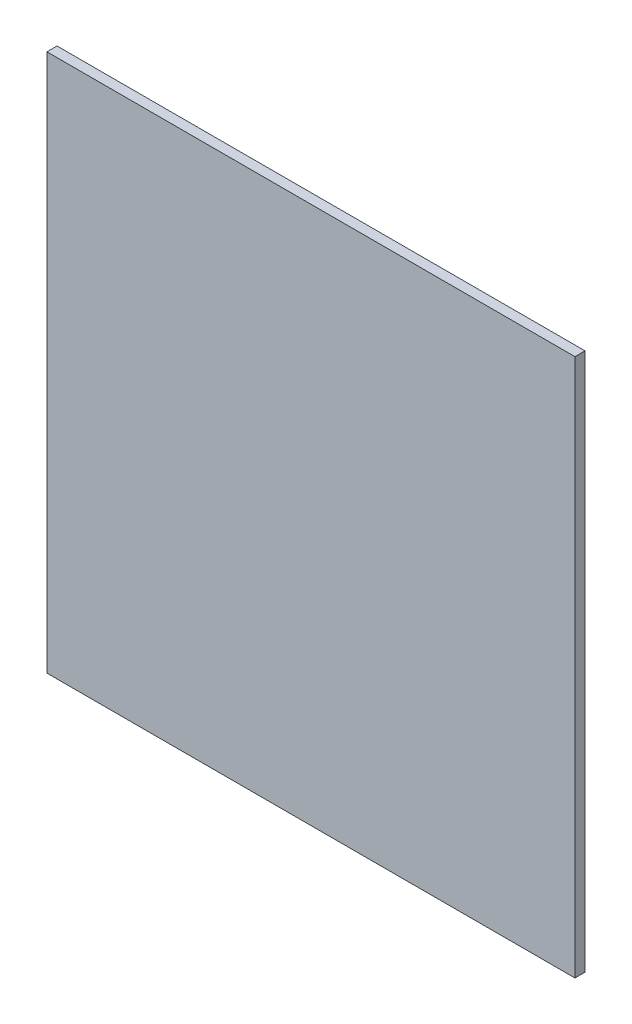
ISO-10303-21;
HEADER;
FILE_DESCRIPTION(('STEP AP214'),'2;1');
FILE_NAME('part.step','',(''),(''),'','','');
FILE_SCHEMA(('AUTOMOTIVE_DESIGN { 1 0 10303 214 1 1 1 1 }'));
ENDSEC;
DATA;
#1=APPLICATION_CONTEXT('core data for automotive mechanical design processes');
#2=APPLICATION_PROTOCOL_DEFINITION('international standard','automotive_design',2000,#1);
#3=PRODUCT_CONTEXT('',#1,'mechanical');
#4=PRODUCT('Part','Part','',(#3));
#5=PRODUCT_RELATED_PRODUCT_CATEGORY('part','',(#4));
#6=PRODUCT_DEFINITION_FORMATION('','',#4);
#7=PRODUCT_DEFINITION_CONTEXT('part definition',#1,'design');
#8=PRODUCT_DEFINITION('design','',#6,#7);
#9=PRODUCT_DEFINITION_SHAPE('','',#8);
#10=(LENGTH_UNIT() NAMED_UNIT(*) SI_UNIT(.MILLI.,.METRE.));
#11=(NAMED_UNIT(*) PLANE_ANGLE_UNIT() SI_UNIT($,.RADIAN.));
#12=(NAMED_UNIT(*) SI_UNIT($,.STERADIAN.) SOLID_ANGLE_UNIT());
#13=UNCERTAINTY_MEASURE_WITH_UNIT(LENGTH_MEASURE(1.E-05),#10,'distance_accuracy_value','');
#14=(GEOMETRIC_REPRESENTATION_CONTEXT(3) GLOBAL_UNCERTAINTY_ASSIGNED_CONTEXT((#13)) GLOBAL_UNIT_ASSIGNED_CONTEXT((#10,
#11,#12)) REPRESENTATION_CONTEXT('',''));
#15=CARTESIAN_POINT('',(0.,0.,0.));
#16=DIRECTION('',(0.,0.,1.));
#17=DIRECTION('',(1.,0.,0.));
#18=AXIS2_PLACEMENT_3D('',#15,#16,#17);
#19=CARTESIAN_POINT('',(0.,0.,1.5));
#20=DIRECTION('',(1.,0.,0.));
#21=DIRECTION('',(0.,0.,-1.));
#22=AXIS2_PLACEMENT_3D('',#19,#20,#21);
#23=PLANE('',#22);
#24=DIRECTION('',(0.,-1.,0.));
#25=VECTOR('',#24,1.);
#26=CARTESIAN_POINT('',(0.,0.,0.));
#27=LINE('',#26,#25);
#28=CARTESIAN_POINT('',(0.,80.,0.));
#29=VERTEX_POINT('',#28);
#30=CARTESIAN_POINT('',(0.,0.,0.));
#31=VERTEX_POINT('',#30);
#32=EDGE_CURVE('E107',#29,#31,#27,.T.);
#33=ORIENTED_EDGE('',*,*,#32,.T.);
#34=DIRECTION('',(0.,0.,-1.));
#35=VECTOR('',#34,1.);
#36=CARTESIAN_POINT('',(0.,0.,1.5));
#37=LINE('',#36,#35);
#38=CARTESIAN_POINT('',(0.,0.,1.5));
#39=VERTEX_POINT('',#38);
#40=EDGE_CURVE('E11',#39,#31,#37,.T.);
#41=ORIENTED_EDGE('',*,*,#40,.F.);
#42=DIRECTION('',(0.,-1.,0.));
#43=VECTOR('',#42,1.);
#44=CARTESIAN_POINT('',(0.,0.,1.5));
#45=LINE('',#44,#43);
#46=CARTESIAN_POINT('',(0.,80.,1.5));
#47=VERTEX_POINT('',#46);
#48=EDGE_CURVE('E91',#47,#39,#45,.T.);
#49=ORIENTED_EDGE('',*,*,#48,.F.);
#50=DIRECTION('',(0.,0.,-1.));
#51=VECTOR('',#50,1.);
#52=CARTESIAN_POINT('',(0.,80.,1.5));
#53=LINE('',#52,#51);
#54=EDGE_CURVE('E103',#47,#29,#53,.T.);
#55=ORIENTED_EDGE('',*,*,#54,.T.);
#56=EDGE_LOOP('',(#33,#41,#49,#55));
#57=FACE_BOUND('',#56,.T.);
#58=ADVANCED_FACE('F39',(#57),#23,.F.);
#59=CARTESIAN_POINT('',(0.,0.,1.5));
#60=DIRECTION('',(0.,1.,0.));
#61=DIRECTION('',(0.,0.,1.));
#62=AXIS2_PLACEMENT_3D('',#59,#60,#61);
#63=PLANE('',#62);
#64=DIRECTION('',(1.,0.,0.));
#65=VECTOR('',#64,1.);
#66=CARTESIAN_POINT('',(0.,0.,0.));
#67=LINE('',#66,#65);
#68=CARTESIAN_POINT('',(78.5,0.,0.));
#69=VERTEX_POINT('',#68);
#70=EDGE_CURVE('E96',#31,#69,#67,.T.);
#71=ORIENTED_EDGE('',*,*,#70,.T.);
#72=DIRECTION('',(0.,0.,-1.));
#73=VECTOR('',#72,1.);
#74=CARTESIAN_POINT('',(78.5,0.,1.5));
#75=LINE('',#74,#73);
#76=CARTESIAN_POINT('',(78.5,0.,1.5));
#77=VERTEX_POINT('',#76);
#78=EDGE_CURVE('E48',#77,#69,#75,.T.);
#79=ORIENTED_EDGE('',*,*,#78,.F.);
#80=DIRECTION('',(1.,0.,0.));
#81=VECTOR('',#80,1.);
#82=CARTESIAN_POINT('',(0.,0.,1.5));
#83=LINE('',#82,#81);
#84=EDGE_CURVE('E86',#39,#77,#83,.T.);
#85=ORIENTED_EDGE('',*,*,#84,.F.);
#86=ORIENTED_EDGE('',*,*,#40,.T.);
#87=EDGE_LOOP('',(#71,#79,#85,#86));
#88=FACE_BOUND('',#87,.T.);
#89=ADVANCED_FACE('F95',(#88),#63,.F.);
#90=CARTESIAN_POINT('',(78.5,0.,1.5));
#91=DIRECTION('',(-1.,0.,0.));
#92=DIRECTION('',(0.,0.,1.));
#93=AXIS2_PLACEMENT_3D('',#90,#91,#92);
#94=PLANE('',#93);
#95=DIRECTION('',(0.,1.,0.));
#96=VECTOR('',#95,1.);
#97=CARTESIAN_POINT('',(78.5,0.,0.));
#98=LINE('',#97,#96);
#99=CARTESIAN_POINT('',(78.5,80.,0.));
#100=VERTEX_POINT('',#99);
#101=EDGE_CURVE('E73',#69,#100,#98,.T.);
#102=ORIENTED_EDGE('',*,*,#101,.T.);
#103=DIRECTION('',(0.,0.,-1.));
#104=VECTOR('',#103,1.);
#105=CARTESIAN_POINT('',(78.5,80.,1.5));
#106=LINE('',#105,#104);
#107=CARTESIAN_POINT('',(78.5,80.,1.5));
#108=VERTEX_POINT('',#107);
#109=EDGE_CURVE('E98',#108,#100,#106,.T.);
#110=ORIENTED_EDGE('',*,*,#109,.F.);
#111=DIRECTION('',(0.,1.,0.));
#112=VECTOR('',#111,1.);
#113=CARTESIAN_POINT('',(78.5,0.,1.5));
#114=LINE('',#113,#112);
#115=EDGE_CURVE('E89',#77,#108,#114,.T.);
#116=ORIENTED_EDGE('',*,*,#115,.F.);
#117=ORIENTED_EDGE('',*,*,#78,.T.);
#118=EDGE_LOOP('',(#102,#110,#116,#117));
#119=FACE_BOUND('',#118,.T.);
#120=ADVANCED_FACE('F99',(#119),#94,.F.);
#121=CARTESIAN_POINT('',(0.,80.,1.5));
#122=DIRECTION('',(0.,-1.,0.));
#123=DIRECTION('',(1.,0.,0.));
#124=AXIS2_PLACEMENT_3D('',#121,#122,#123);
#125=PLANE('',#124);
#126=DIRECTION('',(-1.,0.,0.));
#127=VECTOR('',#126,1.);
#128=CARTESIAN_POINT('',(0.,80.,0.));
#129=LINE('',#128,#127);
#130=EDGE_CURVE('E79',#100,#29,#129,.T.);
#131=ORIENTED_EDGE('',*,*,#130,.T.);
#132=ORIENTED_EDGE('',*,*,#54,.F.);
#133=DIRECTION('',(-1.,0.,0.));
#134=VECTOR('',#133,1.);
#135=CARTESIAN_POINT('',(0.,80.,1.5));
#136=LINE('',#135,#134);
#137=EDGE_CURVE('E56',#108,#47,#136,.T.);
#138=ORIENTED_EDGE('',*,*,#137,.F.);
#139=ORIENTED_EDGE('',*,*,#109,.T.);
#140=EDGE_LOOP('',(#131,#132,#138,#139));
#141=FACE_BOUND('',#140,.T.);
#142=ADVANCED_FACE('F120',(#141),#125,.F.);
#143=CARTESIAN_POINT('',(0.,0.,1.5));
#144=DIRECTION('',(0.,0.,-1.));
#145=DIRECTION('',(-1.,0.,0.));
#146=AXIS2_PLACEMENT_3D('',#143,#144,#145);
#147=PLANE('',#146);
#148=ORIENTED_EDGE('',*,*,#48,.T.);
#149=ORIENTED_EDGE('',*,*,#84,.T.);
#150=ORIENTED_EDGE('',*,*,#115,.T.);
#151=ORIENTED_EDGE('',*,*,#137,.T.);
#152=EDGE_LOOP('',(#148,#149,#150,#151));
#153=FACE_BOUND('',#152,.T.);
#154=ADVANCED_FACE('F87',(#153),#147,.F.);
#155=CARTESIAN_POINT('',(0.,0.,0.));
#156=DIRECTION('',(0.,0.,-1.));
#157=DIRECTION('',(-1.,0.,0.));
#158=AXIS2_PLACEMENT_3D('',#155,#156,#157);
#159=PLANE('',#158);
#160=ORIENTED_EDGE('',*,*,#32,.F.);
#161=ORIENTED_EDGE('',*,*,#130,.F.);
#162=ORIENTED_EDGE('',*,*,#101,.F.);
#163=ORIENTED_EDGE('',*,*,#70,.F.);
#164=EDGE_LOOP('',(#160,#161,#162,#163));
#165=FACE_BOUND('',#164,.T.);
#166=ADVANCED_FACE('F123',(#165),#159,.T.);
#167=CLOSED_SHELL('',(#58,#89,#120,#142,#154,#166));
#168=MANIFOLD_SOLID_BREP('B2',#167);
#169=ADVANCED_BREP_SHAPE_REPRESENTATION('',(#18,#168),#14);
#170=SHAPE_DEFINITION_REPRESENTATION(#9,#169);
ENDSEC;
END-ISO-10303-21;
